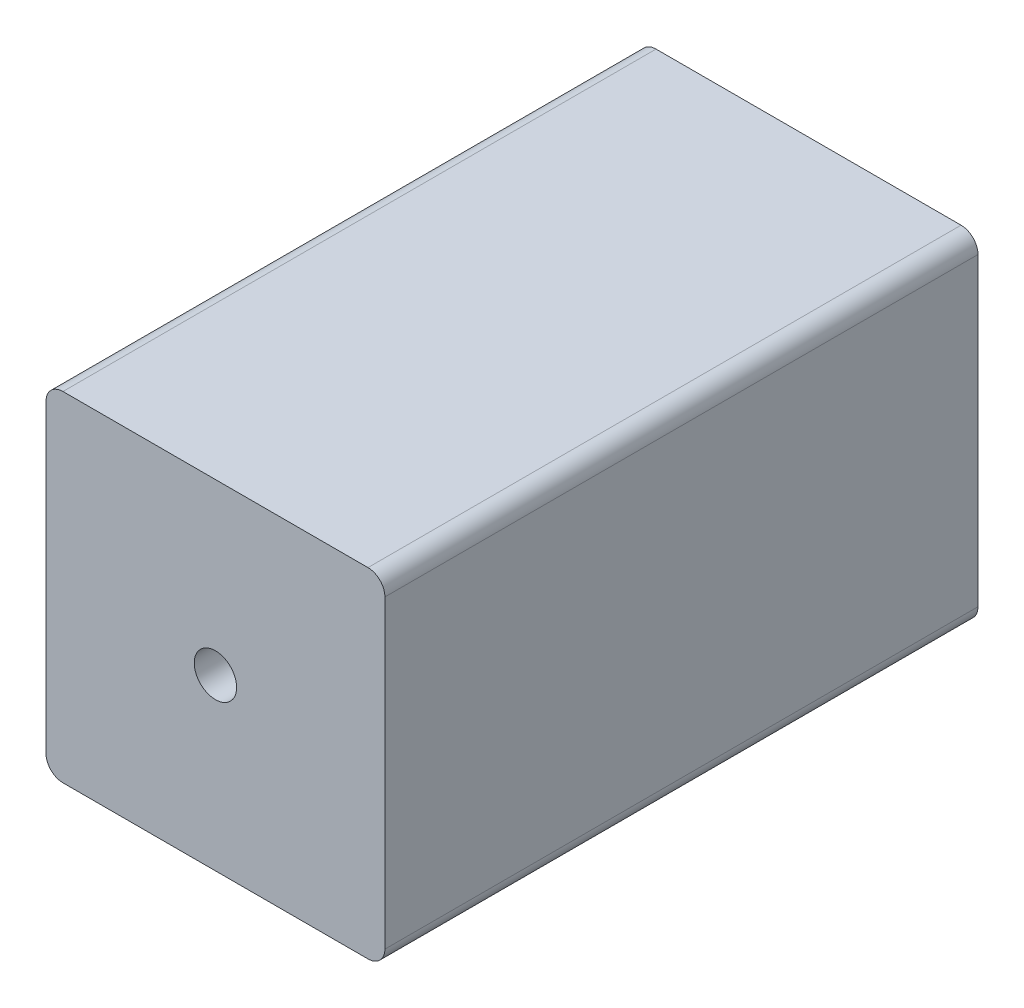
ISO-10303-21;
HEADER;
FILE_DESCRIPTION(('STEP AP214'),'2;1');
FILE_NAME('part.step','',(''),(''),'','','');
FILE_SCHEMA(('AUTOMOTIVE_DESIGN { 1 0 10303 214 1 1 1 1 }'));
ENDSEC;
DATA;
#1=APPLICATION_CONTEXT('core data for automotive mechanical design processes');
#2=APPLICATION_PROTOCOL_DEFINITION('international standard','automotive_design',2000,#1);
#3=PRODUCT_CONTEXT('',#1,'mechanical');
#4=PRODUCT('Part','Part','',(#3));
#5=PRODUCT_RELATED_PRODUCT_CATEGORY('part','',(#4));
#6=PRODUCT_DEFINITION_FORMATION('','',#4);
#7=PRODUCT_DEFINITION_CONTEXT('part definition',#1,'design');
#8=PRODUCT_DEFINITION('design','',#6,#7);
#9=PRODUCT_DEFINITION_SHAPE('','',#8);
#10=(LENGTH_UNIT() NAMED_UNIT(*) SI_UNIT(.MILLI.,.METRE.));
#11=(NAMED_UNIT(*) PLANE_ANGLE_UNIT() SI_UNIT($,.RADIAN.));
#12=(NAMED_UNIT(*) SI_UNIT($,.STERADIAN.) SOLID_ANGLE_UNIT());
#13=UNCERTAINTY_MEASURE_WITH_UNIT(LENGTH_MEASURE(1.E-05),#10,'distance_accuracy_value','');
#14=(GEOMETRIC_REPRESENTATION_CONTEXT(3) GLOBAL_UNCERTAINTY_ASSIGNED_CONTEXT((#13)) GLOBAL_UNIT_ASSIGNED_CONTEXT((#10,
#11,#12)) REPRESENTATION_CONTEXT('',''));
#15=CARTESIAN_POINT('',(0.,0.,0.));
#16=DIRECTION('',(0.,0.,1.));
#17=DIRECTION('',(1.,0.,0.));
#18=AXIS2_PLACEMENT_3D('',#15,#16,#17);
#19=CARTESIAN_POINT('',(0.,0.,35.));
#20=DIRECTION('',(0.,0.,-1.));
#21=DIRECTION('',(-1.,0.,0.));
#22=AXIS2_PLACEMENT_3D('',#19,#20,#21);
#23=PLANE('',#22);
#24=DIRECTION('',(1.,0.,0.));
#25=VECTOR('',#24,1.);
#26=CARTESIAN_POINT('',(-20.,-20.,35.));
#27=LINE('',#26,#25);
#28=CARTESIAN_POINT('',(-18.,-20.,35.));
#29=VERTEX_POINT('',#28);
#30=CARTESIAN_POINT('',(18.,-20.,35.));
#31=VERTEX_POINT('',#30);
#32=EDGE_CURVE('E148',#29,#31,#27,.T.);
#33=ORIENTED_EDGE('',*,*,#32,.T.);
#34=CARTESIAN_POINT('',(18.,-18.,35.));
#35=DIRECTION('',(0.,0.,-1.));
#36=DIRECTION('',(-1.,0.,0.));
#37=AXIS2_PLACEMENT_3D('',#34,#35,#36);
#38=CIRCLE('',#37,2.);
#39=CARTESIAN_POINT('',(20.,-18.,35.));
#40=VERTEX_POINT('',#39);
#41=EDGE_CURVE('E169',#31,#40,#38,.F.);
#42=ORIENTED_EDGE('',*,*,#41,.T.);
#43=DIRECTION('',(0.,1.,0.));
#44=VECTOR('',#43,1.);
#45=CARTESIAN_POINT('',(20.,-20.,35.));
#46=LINE('',#45,#44);
#47=CARTESIAN_POINT('',(20.,18.,35.));
#48=VERTEX_POINT('',#47);
#49=EDGE_CURVE('E134',#40,#48,#46,.T.);
#50=ORIENTED_EDGE('',*,*,#49,.T.);
#51=CARTESIAN_POINT('',(18.,18.,35.));
#52=DIRECTION('',(0.,0.,-1.));
#53=DIRECTION('',(-1.,0.,0.));
#54=AXIS2_PLACEMENT_3D('',#51,#52,#53);
#55=CIRCLE('',#54,2.);
#56=CARTESIAN_POINT('',(18.,20.,35.));
#57=VERTEX_POINT('',#56);
#58=EDGE_CURVE('E165',#48,#57,#55,.F.);
#59=ORIENTED_EDGE('',*,*,#58,.T.);
#60=DIRECTION('',(-1.,0.,0.));
#61=VECTOR('',#60,1.);
#62=CARTESIAN_POINT('',(-20.,20.,35.));
#63=LINE('',#62,#61);
#64=CARTESIAN_POINT('',(-18.,20.,35.));
#65=VERTEX_POINT('',#64);
#66=EDGE_CURVE('E179',#57,#65,#63,.T.);
#67=ORIENTED_EDGE('',*,*,#66,.T.);
#68=CARTESIAN_POINT('',(-18.,18.,35.));
#69=DIRECTION('',(0.,0.,-1.));
#70=DIRECTION('',(-1.,0.,0.));
#71=AXIS2_PLACEMENT_3D('',#68,#69,#70);
#72=CIRCLE('',#71,2.);
#73=CARTESIAN_POINT('',(-20.,18.,35.));
#74=VERTEX_POINT('',#73);
#75=EDGE_CURVE('E68',#65,#74,#72,.F.);
#76=ORIENTED_EDGE('',*,*,#75,.T.);
#77=DIRECTION('',(0.,-1.,0.));
#78=VECTOR('',#77,1.);
#79=CARTESIAN_POINT('',(-20.,-20.,35.));
#80=LINE('',#79,#78);
#81=CARTESIAN_POINT('',(-20.,-18.,35.));
#82=VERTEX_POINT('',#81);
#83=EDGE_CURVE('E189',#74,#82,#80,.T.);
#84=ORIENTED_EDGE('',*,*,#83,.T.);
#85=CARTESIAN_POINT('',(-18.,-18.,35.));
#86=DIRECTION('',(0.,0.,-1.));
#87=DIRECTION('',(-1.,0.,0.));
#88=AXIS2_PLACEMENT_3D('',#85,#86,#87);
#89=CIRCLE('',#88,2.);
#90=EDGE_CURVE('E170',#82,#29,#89,.F.);
#91=ORIENTED_EDGE('',*,*,#90,.T.);
#92=EDGE_LOOP('',(#33,#42,#50,#59,#67,#76,#84,#91));
#93=FACE_BOUND('',#92,.T.);
#94=CARTESIAN_POINT('',(0.,0.,35.));
#95=DIRECTION('',(0.,0.,1.));
#96=DIRECTION('',(1.,0.,0.));
#97=AXIS2_PLACEMENT_3D('',#94,#95,#96);
#98=CIRCLE('',#97,2.5);
#99=CARTESIAN_POINT('',(2.5,0.,35.));
#100=VERTEX_POINT('',#99);
#101=EDGE_CURVE('E142',#100,#100,#98,.T.);
#102=ORIENTED_EDGE('',*,*,#101,.F.);
#103=EDGE_LOOP('',(#102));
#104=FACE_BOUND('',#103,.T.);
#105=ADVANCED_FACE('F50',(#93,#104),#23,.F.);
#106=CARTESIAN_POINT('',(0.,0.,-35.));
#107=DIRECTION('',(0.,0.,-1.));
#108=DIRECTION('',(-1.,0.,0.));
#109=AXIS2_PLACEMENT_3D('',#106,#107,#108);
#110=PLANE('',#109);
#111=DIRECTION('',(0.,1.,0.));
#112=VECTOR('',#111,1.);
#113=CARTESIAN_POINT('',(20.,-20.,-35.));
#114=LINE('',#113,#112);
#115=CARTESIAN_POINT('',(20.,-18.,-35.));
#116=VERTEX_POINT('',#115);
#117=CARTESIAN_POINT('',(20.,18.,-35.));
#118=VERTEX_POINT('',#117);
#119=EDGE_CURVE('E128',#116,#118,#114,.T.);
#120=ORIENTED_EDGE('',*,*,#119,.F.);
#121=CARTESIAN_POINT('',(18.,-18.,-35.));
#122=DIRECTION('',(0.,0.,-1.));
#123=DIRECTION('',(-1.,0.,0.));
#124=AXIS2_PLACEMENT_3D('',#121,#122,#123);
#125=CIRCLE('',#124,2.);
#126=CARTESIAN_POINT('',(18.,-20.,-35.));
#127=VERTEX_POINT('',#126);
#128=EDGE_CURVE('E113',#116,#127,#125,.T.);
#129=ORIENTED_EDGE('',*,*,#128,.T.);
#130=DIRECTION('',(1.,0.,0.));
#131=VECTOR('',#130,1.);
#132=CARTESIAN_POINT('',(-20.,-20.,-35.));
#133=LINE('',#132,#131);
#134=CARTESIAN_POINT('',(-18.,-20.,-35.));
#135=VERTEX_POINT('',#134);
#136=EDGE_CURVE('E153',#135,#127,#133,.T.);
#137=ORIENTED_EDGE('',*,*,#136,.F.);
#138=CARTESIAN_POINT('',(-18.,-18.,-35.));
#139=DIRECTION('',(0.,0.,-1.));
#140=DIRECTION('',(-1.,0.,0.));
#141=AXIS2_PLACEMENT_3D('',#138,#139,#140);
#142=CIRCLE('',#141,2.);
#143=CARTESIAN_POINT('',(-20.,-18.,-35.));
#144=VERTEX_POINT('',#143);
#145=EDGE_CURVE('E121',#135,#144,#142,.T.);
#146=ORIENTED_EDGE('',*,*,#145,.T.);
#147=DIRECTION('',(0.,-1.,0.));
#148=VECTOR('',#147,1.);
#149=CARTESIAN_POINT('',(-20.,-20.,-35.));
#150=LINE('',#149,#148);
#151=CARTESIAN_POINT('',(-20.,18.,-35.));
#152=VERTEX_POINT('',#151);
#153=EDGE_CURVE('E144',#152,#144,#150,.T.);
#154=ORIENTED_EDGE('',*,*,#153,.F.);
#155=CARTESIAN_POINT('',(-18.,18.,-35.));
#156=DIRECTION('',(0.,0.,-1.));
#157=DIRECTION('',(-1.,0.,0.));
#158=AXIS2_PLACEMENT_3D('',#155,#156,#157);
#159=CIRCLE('',#158,2.);
#160=CARTESIAN_POINT('',(-18.,20.,-35.));
#161=VERTEX_POINT('',#160);
#162=EDGE_CURVE('E158',#152,#161,#159,.T.);
#163=ORIENTED_EDGE('',*,*,#162,.T.);
#164=DIRECTION('',(-1.,0.,0.));
#165=VECTOR('',#164,1.);
#166=CARTESIAN_POINT('',(-20.,20.,-35.));
#167=LINE('',#166,#165);
#168=CARTESIAN_POINT('',(18.,20.,-35.));
#169=VERTEX_POINT('',#168);
#170=EDGE_CURVE('E139',#169,#161,#167,.T.);
#171=ORIENTED_EDGE('',*,*,#170,.F.);
#172=CARTESIAN_POINT('',(18.,18.,-35.));
#173=DIRECTION('',(0.,0.,-1.));
#174=DIRECTION('',(-1.,0.,0.));
#175=AXIS2_PLACEMENT_3D('',#172,#173,#174);
#176=CIRCLE('',#175,2.);
#177=EDGE_CURVE('E133',#169,#118,#176,.T.);
#178=ORIENTED_EDGE('',*,*,#177,.T.);
#179=EDGE_LOOP('',(#120,#129,#137,#146,#154,#163,#171,#178));
#180=FACE_BOUND('',#179,.T.);
#181=CARTESIAN_POINT('',(0.,0.,-35.));
#182=DIRECTION('',(0.,0.,1.));
#183=DIRECTION('',(1.,0.,0.));
#184=AXIS2_PLACEMENT_3D('',#181,#182,#183);
#185=CIRCLE('',#184,2.5);
#186=CARTESIAN_POINT('',(2.5,0.,-35.));
#187=VERTEX_POINT('',#186);
#188=EDGE_CURVE('E150',#187,#187,#185,.T.);
#189=ORIENTED_EDGE('',*,*,#188,.T.);
#190=EDGE_LOOP('',(#189));
#191=FACE_BOUND('',#190,.T.);
#192=ADVANCED_FACE('F140',(#180,#191),#110,.T.);
#193=CARTESIAN_POINT('',(20.,-20.,35.));
#194=DIRECTION('',(-1.,0.,0.));
#195=DIRECTION('',(0.,0.,1.));
#196=AXIS2_PLACEMENT_3D('',#193,#194,#195);
#197=PLANE('',#196);
#198=ORIENTED_EDGE('',*,*,#49,.F.);
#199=DIRECTION('',(0.,0.,-1.));
#200=VECTOR('',#199,1.);
#201=CARTESIAN_POINT('',(20.,-18.,35.));
#202=LINE('',#201,#200);
#203=EDGE_CURVE('E120',#40,#116,#202,.T.);
#204=ORIENTED_EDGE('',*,*,#203,.T.);
#205=ORIENTED_EDGE('',*,*,#119,.T.);
#206=DIRECTION('',(0.,0.,-1.));
#207=VECTOR('',#206,1.);
#208=CARTESIAN_POINT('',(20.,18.,35.));
#209=LINE('',#208,#207);
#210=EDGE_CURVE('E135',#118,#48,#209,.F.);
#211=ORIENTED_EDGE('',*,*,#210,.T.);
#212=EDGE_LOOP('',(#198,#204,#205,#211));
#213=FACE_BOUND('',#212,.T.);
#214=ADVANCED_FACE('F126',(#213),#197,.F.);
#215=CARTESIAN_POINT('',(-20.,20.,35.));
#216=DIRECTION('',(0.,-1.,0.));
#217=DIRECTION('',(0.,0.,-1.));
#218=AXIS2_PLACEMENT_3D('',#215,#216,#217);
#219=PLANE('',#218);
#220=ORIENTED_EDGE('',*,*,#170,.T.);
#221=DIRECTION('',(0.,0.,-1.));
#222=VECTOR('',#221,1.);
#223=CARTESIAN_POINT('',(-18.,20.,35.));
#224=LINE('',#223,#222);
#225=EDGE_CURVE('E11',#161,#65,#224,.F.);
#226=ORIENTED_EDGE('',*,*,#225,.T.);
#227=ORIENTED_EDGE('',*,*,#66,.F.);
#228=DIRECTION('',(0.,0.,-1.));
#229=VECTOR('',#228,1.);
#230=CARTESIAN_POINT('',(18.,20.,35.));
#231=LINE('',#230,#229);
#232=EDGE_CURVE('E54',#57,#169,#231,.T.);
#233=ORIENTED_EDGE('',*,*,#232,.T.);
#234=EDGE_LOOP('',(#220,#226,#227,#233));
#235=FACE_BOUND('',#234,.T.);
#236=ADVANCED_FACE('F178',(#235),#219,.F.);
#237=CARTESIAN_POINT('',(-20.,-20.,35.));
#238=DIRECTION('',(1.,0.,0.));
#239=DIRECTION('',(0.,0.,-1.));
#240=AXIS2_PLACEMENT_3D('',#237,#238,#239);
#241=PLANE('',#240);
#242=ORIENTED_EDGE('',*,*,#153,.T.);
#243=DIRECTION('',(0.,0.,-1.));
#244=VECTOR('',#243,1.);
#245=CARTESIAN_POINT('',(-20.,-18.,35.));
#246=LINE('',#245,#244);
#247=EDGE_CURVE('E65',#144,#82,#246,.F.);
#248=ORIENTED_EDGE('',*,*,#247,.T.);
#249=ORIENTED_EDGE('',*,*,#83,.F.);
#250=DIRECTION('',(0.,0.,-1.));
#251=VECTOR('',#250,1.);
#252=CARTESIAN_POINT('',(-20.,18.,35.));
#253=LINE('',#252,#251);
#254=EDGE_CURVE('E171',#74,#152,#253,.T.);
#255=ORIENTED_EDGE('',*,*,#254,.T.);
#256=EDGE_LOOP('',(#242,#248,#249,#255));
#257=FACE_BOUND('',#256,.T.);
#258=ADVANCED_FACE('F190',(#257),#241,.F.);
#259=CARTESIAN_POINT('',(-20.,-20.,35.));
#260=DIRECTION('',(0.,1.,0.));
#261=DIRECTION('',(0.,0.,1.));
#262=AXIS2_PLACEMENT_3D('',#259,#260,#261);
#263=PLANE('',#262);
#264=ORIENTED_EDGE('',*,*,#136,.T.);
#265=DIRECTION('',(0.,0.,-1.));
#266=VECTOR('',#265,1.);
#267=CARTESIAN_POINT('',(18.,-20.,35.));
#268=LINE('',#267,#266);
#269=EDGE_CURVE('E117',#127,#31,#268,.F.);
#270=ORIENTED_EDGE('',*,*,#269,.T.);
#271=ORIENTED_EDGE('',*,*,#32,.F.);
#272=DIRECTION('',(0.,0.,-1.));
#273=VECTOR('',#272,1.);
#274=CARTESIAN_POINT('',(-18.,-20.,35.));
#275=LINE('',#274,#273);
#276=EDGE_CURVE('E124',#29,#135,#275,.T.);
#277=ORIENTED_EDGE('',*,*,#276,.T.);
#278=EDGE_LOOP('',(#264,#270,#271,#277));
#279=FACE_BOUND('',#278,.T.);
#280=ADVANCED_FACE('F198',(#279),#263,.F.);
#281=CARTESIAN_POINT('',(0.,0.,35.));
#282=DIRECTION('',(0.,0.,-1.));
#283=DIRECTION('',(-1.,0.,0.));
#284=AXIS2_PLACEMENT_3D('',#281,#282,#283);
#285=CYLINDRICAL_SURFACE('',#284,2.5);
#286=ORIENTED_EDGE('',*,*,#101,.T.);
#287=EDGE_LOOP('',(#286));
#288=FACE_BOUND('',#287,.T.);
#289=ORIENTED_EDGE('',*,*,#188,.F.);
#290=EDGE_LOOP('',(#289));
#291=FACE_BOUND('',#290,.T.);
#292=ADVANCED_FACE('F197',(#288,#291),#285,.F.);
#293=CARTESIAN_POINT('',(18.,-18.,35.));
#294=DIRECTION('',(0.,0.,-1.));
#295=DIRECTION('',(-1.,0.,0.));
#296=AXIS2_PLACEMENT_3D('',#293,#294,#295);
#297=CYLINDRICAL_SURFACE('',#296,2.);
#298=ORIENTED_EDGE('',*,*,#41,.F.);
#299=ORIENTED_EDGE('',*,*,#269,.F.);
#300=ORIENTED_EDGE('',*,*,#128,.F.);
#301=ORIENTED_EDGE('',*,*,#203,.F.);
#302=EDGE_LOOP('',(#298,#299,#300,#301));
#303=FACE_BOUND('',#302,.T.);
#304=ADVANCED_FACE('F116',(#303),#297,.T.);
#305=CARTESIAN_POINT('',(-18.,-18.,35.));
#306=DIRECTION('',(0.,0.,-1.));
#307=DIRECTION('',(-1.,0.,0.));
#308=AXIS2_PLACEMENT_3D('',#305,#306,#307);
#309=CYLINDRICAL_SURFACE('',#308,2.);
#310=ORIENTED_EDGE('',*,*,#90,.F.);
#311=ORIENTED_EDGE('',*,*,#247,.F.);
#312=ORIENTED_EDGE('',*,*,#145,.F.);
#313=ORIENTED_EDGE('',*,*,#276,.F.);
#314=EDGE_LOOP('',(#310,#311,#312,#313));
#315=FACE_BOUND('',#314,.T.);
#316=ADVANCED_FACE('F207',(#315),#309,.T.);
#317=CARTESIAN_POINT('',(-18.,18.,35.));
#318=DIRECTION('',(0.,0.,-1.));
#319=DIRECTION('',(-1.,0.,0.));
#320=AXIS2_PLACEMENT_3D('',#317,#318,#319);
#321=CYLINDRICAL_SURFACE('',#320,2.);
#322=ORIENTED_EDGE('',*,*,#75,.F.);
#323=ORIENTED_EDGE('',*,*,#225,.F.);
#324=ORIENTED_EDGE('',*,*,#162,.F.);
#325=ORIENTED_EDGE('',*,*,#254,.F.);
#326=EDGE_LOOP('',(#322,#323,#324,#325));
#327=FACE_BOUND('',#326,.T.);
#328=ADVANCED_FACE('F187',(#327),#321,.T.);
#329=CARTESIAN_POINT('',(18.,18.,35.));
#330=DIRECTION('',(0.,0.,-1.));
#331=DIRECTION('',(-1.,0.,0.));
#332=AXIS2_PLACEMENT_3D('',#329,#330,#331);
#333=CYLINDRICAL_SURFACE('',#332,2.);
#334=ORIENTED_EDGE('',*,*,#58,.F.);
#335=ORIENTED_EDGE('',*,*,#210,.F.);
#336=ORIENTED_EDGE('',*,*,#177,.F.);
#337=ORIENTED_EDGE('',*,*,#232,.F.);
#338=EDGE_LOOP('',(#334,#335,#336,#337));
#339=FACE_BOUND('',#338,.T.);
#340=ADVANCED_FACE('F47',(#339),#333,.T.);
#341=CLOSED_SHELL('',(#105,#192,#214,#236,#258,#280,#292,#304,#316,#328,#340));
#342=MANIFOLD_SOLID_BREP('B2',#341);
#343=ADVANCED_BREP_SHAPE_REPRESENTATION('',(#18,#342),#14);
#344=SHAPE_DEFINITION_REPRESENTATION(#9,#343);
ENDSEC;
END-ISO-10303-21;
